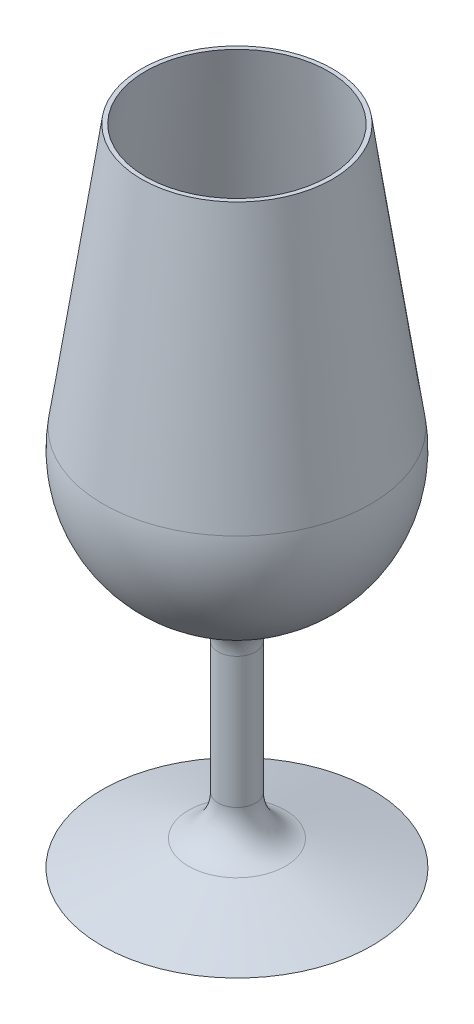
ISO-10303-21;
HEADER;
FILE_DESCRIPTION(('STEP AP214'),'2;1');
FILE_NAME('part.step','',(''),(''),'','','');
FILE_SCHEMA(('AUTOMOTIVE_DESIGN { 1 0 10303 214 1 1 1 1 }'));
ENDSEC;
DATA;
#1=APPLICATION_CONTEXT('core data for automotive mechanical design processes');
#2=APPLICATION_PROTOCOL_DEFINITION('international standard','automotive_design',2000,#1);
#3=PRODUCT_CONTEXT('',#1,'mechanical');
#4=PRODUCT('Part','Part','',(#3));
#5=PRODUCT_RELATED_PRODUCT_CATEGORY('part','',(#4));
#6=PRODUCT_DEFINITION_FORMATION('','',#4);
#7=PRODUCT_DEFINITION_CONTEXT('part definition',#1,'design');
#8=PRODUCT_DEFINITION('design','',#6,#7);
#9=PRODUCT_DEFINITION_SHAPE('','',#8);
#10=(LENGTH_UNIT() NAMED_UNIT(*) SI_UNIT(.MILLI.,.METRE.));
#11=(NAMED_UNIT(*) PLANE_ANGLE_UNIT() SI_UNIT($,.RADIAN.));
#12=(NAMED_UNIT(*) SI_UNIT($,.STERADIAN.) SOLID_ANGLE_UNIT());
#13=UNCERTAINTY_MEASURE_WITH_UNIT(LENGTH_MEASURE(1.E-05),#10,'distance_accuracy_value','');
#14=(GEOMETRIC_REPRESENTATION_CONTEXT(3) GLOBAL_UNCERTAINTY_ASSIGNED_CONTEXT((#13)) GLOBAL_UNIT_ASSIGNED_CONTEXT((#10,
#11,#12)) REPRESENTATION_CONTEXT('',''));
#15=CARTESIAN_POINT('',(0.,0.,0.));
#16=DIRECTION('',(0.,0.,1.));
#17=DIRECTION('',(1.,0.,0.));
#18=AXIS2_PLACEMENT_3D('',#15,#16,#17);
#19=CARTESIAN_POINT('',(0.,-37.0912982763871,0.));
#20=DIRECTION('',(0.,1.,0.));
#21=DIRECTION('',(0.,0.,1.));
#22=AXIS2_PLACEMENT_3D('',#19,#20,#21);
#23=PLANE('',#22);
#24=CARTESIAN_POINT('',(0.,-37.0912982763871,0.));
#25=DIRECTION('',(0.,1.,0.));
#26=DIRECTION('',(0.,0.,1.));
#27=AXIS2_PLACEMENT_3D('',#24,#25,#26);
#28=CIRCLE('',#27,32.5);
#29=CARTESIAN_POINT('',(0.,-37.0912982763871,32.5));
#30=VERTEX_POINT('',#29);
#31=EDGE_CURVE('E10',#30,#30,#28,.T.);
#32=ORIENTED_EDGE('',*,*,#31,.F.);
#33=EDGE_LOOP('',(#32));
#34=FACE_BOUND('',#33,.T.);
#35=ADVANCED_FACE('F37',(#34),#23,.F.);
#36=CARTESIAN_POINT('',(0.,-37.0912982763871,0.));
#37=DIRECTION('',(0.,-1.,0.));
#38=DIRECTION('',(0.,0.,-1.));
#39=AXIS2_PLACEMENT_3D('',#36,#37,#38);
#40=CONICAL_SURFACE('',#39,32.5,1.28350582245761);
#41=CARTESIAN_POINT('',(0.,-30.9357267356772,0.));
#42=DIRECTION('',(0.,1.,0.));
#43=DIRECTION('',(0.,0.,1.));
#44=AXIS2_PLACEMENT_3D('',#41,#42,#43);
#45=CIRCLE('',#44,11.6664517898233);
#46=CARTESIAN_POINT('',(0.,-30.9357267356772,11.6664517898233));
#47=VERTEX_POINT('',#46);
#48=EDGE_CURVE('E44',#47,#47,#45,.T.);
#49=ORIENTED_EDGE('',*,*,#48,.F.);
#50=EDGE_LOOP('',(#49));
#51=FACE_BOUND('',#50,.T.);
#52=ORIENTED_EDGE('',*,*,#31,.T.);
#53=EDGE_LOOP('',(#52));
#54=FACE_BOUND('',#53,.T.);
#55=ADVANCED_FACE('F121',(#51,#54),#40,.T.);
#56=CARTESIAN_POINT('',(0.,-21.3455753009706,0.));
#57=DIRECTION('',(0.,1.,0.));
#58=DIRECTION('',(0.,0.,1.));
#59=AXIS2_PLACEMENT_3D('',#56,#57,#58);
#60=TOROIDAL_SURFACE('',#59,14.5,10.);
#61=CARTESIAN_POINT('',(0.,-21.3455753009706,0.));
#62=DIRECTION('',(0.,1.,0.));
#63=DIRECTION('',(0.,0.,1.));
#64=AXIS2_PLACEMENT_3D('',#61,#62,#63);
#65=CIRCLE('',#64,4.50000000000001);
#66=CARTESIAN_POINT('',(0.,-21.3455753009706,4.50000000000001));
#67=VERTEX_POINT('',#66);
#68=EDGE_CURVE('E49',#67,#67,#65,.T.);
#69=ORIENTED_EDGE('',*,*,#68,.F.);
#70=EDGE_LOOP('',(#69));
#71=FACE_BOUND('',#70,.T.);
#72=ORIENTED_EDGE('',*,*,#48,.T.);
#73=EDGE_LOOP('',(#72));
#74=FACE_BOUND('',#73,.T.);
#75=ADVANCED_FACE('F116',(#71,#74),#60,.F.);
#76=CARTESIAN_POINT('',(0.,117.908701723613,0.));
#77=DIRECTION('',(0.,1.,0.));
#78=DIRECTION('',(0.,0.,1.));
#79=AXIS2_PLACEMENT_3D('',#76,#77,#78);
#80=CYLINDRICAL_SURFACE('',#79,4.50000000000001);
#81=CARTESIAN_POINT('',(0.,10.1456868915987,0.));
#82=DIRECTION('',(0.,1.,0.));
#83=DIRECTION('',(0.,0.,1.));
#84=AXIS2_PLACEMENT_3D('',#81,#82,#83);
#85=CIRCLE('',#84,4.50000000000001);
#86=CARTESIAN_POINT('',(0.,10.1456868915987,4.50000000000001));
#87=VERTEX_POINT('',#86);
#88=EDGE_CURVE('E54',#87,#87,#85,.T.);
#89=ORIENTED_EDGE('',*,*,#88,.F.);
#90=EDGE_LOOP('',(#89));
#91=FACE_BOUND('',#90,.T.);
#92=ORIENTED_EDGE('',*,*,#68,.T.);
#93=EDGE_LOOP('',(#92));
#94=FACE_BOUND('',#93,.T.);
#95=ADVANCED_FACE('F110',(#91,#94),#80,.T.);
#96=CARTESIAN_POINT('',(0.,10.1456868915987,0.));
#97=DIRECTION('',(0.,1.,0.));
#98=DIRECTION('',(0.,0.,1.));
#99=AXIS2_PLACEMENT_3D('',#96,#97,#98);
#100=TOROIDAL_SURFACE('',#99,14.5,10.);
#101=CARTESIAN_POINT('',(0.,19.545679529452,0.));
#102=DIRECTION('',(0.,1.,0.));
#103=DIRECTION('',(0.,0.,1.));
#104=AXIS2_PLACEMENT_3D('',#101,#102,#103);
#105=CIRCLE('',#104,11.0882352941177);
#106=CARTESIAN_POINT('',(11.0882352941176,19.545679529452,0.));
#107=VERTEX_POINT('',#106);
#108=EDGE_CURVE('E60',#107,#107,#105,.T.);
#109=ORIENTED_EDGE('',*,*,#108,.F.);
#110=EDGE_LOOP('',(#109));
#111=FACE_BOUND('',#110,.T.);
#112=ORIENTED_EDGE('',*,*,#88,.T.);
#113=EDGE_LOOP('',(#112));
#114=FACE_BOUND('',#113,.T.);
#115=ADVANCED_FACE('F104',(#111,#114),#100,.F.);
#116=CARTESIAN_POINT('',(0.,50.095655602475,0.));
#117=DIRECTION('',(0.,1.,0.));
#118=DIRECTION('',(1.,0.,0.));
#119=AXIS2_PLACEMENT_3D('',#116,#117,#118);
#120=SPHERICAL_SURFACE('',#119,32.5);
#121=CARTESIAN_POINT('',(0.,54.7628687751407,0.));
#122=DIRECTION('',(0.,1.,0.));
#123=DIRECTION('',(0.,0.,1.));
#124=AXIS2_PLACEMENT_3D('',#121,#122,#123);
#125=CIRCLE('',#124,32.1631329506455);
#126=CARTESIAN_POINT('',(32.1631329506455,54.7628687751407,0.));
#127=VERTEX_POINT('',#126);
#128=EDGE_CURVE('E64',#127,#127,#125,.T.);
#129=CARTESIAN_POINT('',(32.1631329506455,54.7628687751407,0.));
#130=CARTESIAN_POINT('',(32.2295855764521,54.3049693005461,0.));
#131=CARTESIAN_POINT('',(32.2862470117428,53.8456495036334,0.));
#132=CARTESIAN_POINT('',(32.3799124329892,52.9250098961236,0.));
#133=CARTESIAN_POINT('',(32.4169164189449,52.4636900855266,0.));
#134=CARTESIAN_POINT('',(32.4711918732182,51.5398910816006,0.));
#135=CARTESIAN_POINT('',(32.4884633415358,51.0774118882715,0.));
#136=CARTESIAN_POINT('',(32.5032442892444,50.1521378418659,0.));
#137=CARTESIAN_POINT('',(32.5007537686355,49.6893429887892,0.));
#138=CARTESIAN_POINT('',(32.4760147369736,48.7642816597027,0.));
#139=CARTESIAN_POINT('',(32.4537662259206,48.3020151836928,0.));
#140=CARTESIAN_POINT('',(32.3895519382196,47.3788537520232,0.));
#141=CARTESIAN_POINT('',(32.3475861615715,46.9179587963634,0.));
#142=CARTESIAN_POINT('',(32.2440138450611,45.9983810283555,0.));
#143=CARTESIAN_POINT('',(32.1824073051988,45.5396982160074,0.));
#144=CARTESIAN_POINT('',(32.0396658369768,44.6253813278921,0.));
#145=CARTESIAN_POINT('',(31.958530908617,44.1697472521247,0.));
#146=CARTESIAN_POINT('',(31.7768806427019,43.2623588684949,0.));
#147=CARTESIAN_POINT('',(31.6763653051466,42.8106045606323,0.));
#148=CARTESIAN_POINT('',(31.4561375516523,41.911799668184,0.));
#149=CARTESIAN_POINT('',(31.3364251357134,41.4647490835983,0.));
#150=CARTESIAN_POINT('',(31.0780215688887,40.5761670138512,0.));
#151=CARTESIAN_POINT('',(30.9393304180028,40.1346355286898,0.));
#152=CARTESIAN_POINT('',(30.6432223403166,39.2578969676724,0.));
#153=CARTESIAN_POINT('',(30.4858054135161,38.8226898918162,0.));
#154=CARTESIAN_POINT('',(30.1525328969328,37.9593939241843,0.));
#155=CARTESIAN_POINT('',(29.9766773071498,37.5313050324084,0.));
#156=CARTESIAN_POINT('',(29.6068482078542,36.6830262248483,0.));
#157=CARTESIAN_POINT('',(29.4128746983416,36.262836309064,0.));
#158=CARTESIAN_POINT('',(29.007163548133,35.4311218384449,0.));
#159=CARTESIAN_POINT('',(28.795425907437,35.0195972836101,0.));
#160=CARTESIAN_POINT('',(28.3545726834323,34.2059641150841,0.));
#161=CARTESIAN_POINT('',(28.1254571001236,33.8038555013929,0.));
#162=CARTESIAN_POINT('',(27.6502658751168,33.0097876216009,0.));
#163=CARTESIAN_POINT('',(27.4041902334187,32.6178283554999,0.));
#164=CARTESIAN_POINT('',(26.8955277093303,31.8447740659258,0.));
#165=CARTESIAN_POINT('',(26.63294082694,31.4636790424526,0.));
#166=CARTESIAN_POINT('',(26.0917347540382,30.7130483178649,0.));
#167=CARTESIAN_POINT('',(25.8131155635267,30.3435126167504,0.));
#168=CARTESIAN_POINT('',(25.240353048303,29.6166745335462,0.));
#169=CARTESIAN_POINT('',(24.9462097235907,29.2593721514565,0.));
#170=CARTESIAN_POINT('',(24.3429354283731,28.5576523906052,0.));
#171=CARTESIAN_POINT('',(24.0338044578678,28.2132350118436,0.));
#172=CARTESIAN_POINT('',(23.4011186954665,27.53791344096,0.));
#173=CARTESIAN_POINT('',(23.0775639035706,27.2070092488379,0.));
#174=CARTESIAN_POINT('',(22.4166206303916,26.5593175878886,0.));
#175=CARTESIAN_POINT('',(22.0792321491085,26.2425301190614,0.));
#176=CARTESIAN_POINT('',(21.3912368605415,25.6236496936094,0.));
#177=CARTESIAN_POINT('',(21.0406300532576,25.3215567369845,0.));
#178=CARTESIAN_POINT('',(20.3268375846329,24.732616324389,0.));
#179=CARTESIAN_POINT('',(19.9636519232922,24.4457688684184,0.));
#180=CARTESIAN_POINT('',(19.2253641624486,23.88784263599,0.));
#181=CARTESIAN_POINT('',(18.8502620629457,23.6167638595322,0.));
#182=CARTESIAN_POINT('',(18.0888255709987,23.0908694168034,0.));
#183=CARTESIAN_POINT('',(17.7024911785546,22.8360537505323,0.));
#184=CARTESIAN_POINT('',(16.9192947515051,22.3431502505202,0.));
#185=CARTESIAN_POINT('',(16.5224327168998,22.105062416779,0.));
#186=CARTESIAN_POINT('',(15.7189047869106,21.6460489660108,0.));
#187=CARTESIAN_POINT('',(15.3122388915267,21.4251233489837,0.));
#188=CARTESIAN_POINT('',(14.4898451667864,21.0008367726289,0.));
#189=CARTESIAN_POINT('',(14.07411733743,20.797475813301,0.));
#190=CARTESIAN_POINT('',(13.2343572138089,20.4086913494046,0.));
#191=CARTESIAN_POINT('',(12.8103249195442,20.2232678448361,0.));
#192=CARTESIAN_POINT('',(11.9547321608093,19.8706894432665,0.));
#193=CARTESIAN_POINT('',(11.5231716963392,19.7035345462654,0.));
#194=CARTESIAN_POINT('',(11.0882352941176,19.545679529452,0.));
#195=B_SPLINE_CURVE_WITH_KNOTS('',3,(#129,#130,#131,#132,#133,#134,#135,#136,#137,#138,#139,
#140,#141,#142,#143,#144,#145,#146,#147,#148,#149,#150,#151,#152,#153,#154,#155,#156,#157,#158,
#159,#160,#161,#162,#163,#164,#165,#166,#167,#168,#169,#170,#171,#172,#173,#174,#175,#176,#177,
#178,#179,#180,#181,#182,#183,#184,#185,#186,#187,#188,#189,#190,#191,#192,#193,#194),
.UNSPECIFIED.,.F.,.F.,(4,2,2,2,2,2,2,2,2,2,2,2,2,2,2,2,2,2,2,2,2,2,2,2,2,2,2,2,2,2,2,2,4),(0.,
1.3879826400544,2.77596528010881,4.16394792016321,5.55193056021761,6.93991320027201,
8.32789584032642,9.71587848038082,11.1038611204352,12.4918437604896,13.879826400544,
15.2678090405984,16.6557916806528,18.0437743207072,19.4317569607616,20.819739600816,
22.2077222408705,23.5957048809248,24.9836875209792,26.3716701610337,27.7596528010881,
29.1476354411425,30.5356180811969,31.9236007212513,33.3115833613057,34.6995660013601,
36.0875486414145,37.4755312814689,38.8635139215233,40.2514965615777,41.6394792016321,
43.0274618416865,44.4154444817409),.UNSPECIFIED.);
#196=EDGE_CURVE('BSEAM98',#127,#107,#195,.T.);
#197=ORIENTED_EDGE('',*,*,#128,.F.);
#198=ORIENTED_EDGE('',*,*,#108,.T.);
#199=ORIENTED_EDGE('',*,*,#196,.T.);
#200=ORIENTED_EDGE('',*,*,#196,.F.);
#201=EDGE_LOOP('',(#197,#199,#198,#200));
#202=FACE_BOUND('',#201,.T.);
#203=ADVANCED_FACE('F98',(#202),#120,.T.);
#204=CARTESIAN_POINT('',(0.,54.7628687751407,0.));
#205=DIRECTION('',(0.,-1.,0.));
#206=DIRECTION('',(0.,0.,-1.));
#207=AXIS2_PLACEMENT_3D('',#204,#205,#206);
#208=CONICAL_SURFACE('',#207,32.1631329506455,0.144104792839711);
#209=CARTESIAN_POINT('',(0.,117.908701723613,0.));
#210=DIRECTION('',(0.,1.,0.));
#211=DIRECTION('',(0.,0.,1.));
#212=AXIS2_PLACEMENT_3D('',#209,#210,#211);
#213=CIRCLE('',#212,23.);
#214=CARTESIAN_POINT('',(0.,117.908701723613,23.));
#215=VERTEX_POINT('',#214);
#216=EDGE_CURVE('E68',#215,#215,#213,.T.);
#217=ORIENTED_EDGE('',*,*,#216,.F.);
#218=EDGE_LOOP('',(#217));
#219=FACE_BOUND('',#218,.T.);
#220=ORIENTED_EDGE('',*,*,#128,.T.);
#221=EDGE_LOOP('',(#220));
#222=FACE_BOUND('',#221,.T.);
#223=ADVANCED_FACE('F92',(#219,#222),#208,.T.);
#224=CARTESIAN_POINT('',(21.9895262986391,117.908701723613,0.));
#225=DIRECTION('',(0.,-1.,0.));
#226=DIRECTION('',(0.,0.,-1.));
#227=AXIS2_PLACEMENT_3D('',#224,#225,#226);
#228=PLANE('',#227);
#229=CARTESIAN_POINT('',(0.,117.908701723613,0.));
#230=DIRECTION('',(0.,1.,0.));
#231=DIRECTION('',(0.,0.,1.));
#232=AXIS2_PLACEMENT_3D('',#229,#230,#231);
#233=CIRCLE('',#232,21.9895262986391);
#234=CARTESIAN_POINT('',(0.,117.908701723613,21.9895262986391));
#235=VERTEX_POINT('',#234);
#236=EDGE_CURVE('E72',#235,#235,#233,.T.);
#237=ORIENTED_EDGE('',*,*,#236,.F.);
#238=EDGE_LOOP('',(#237));
#239=FACE_BOUND('',#238,.T.);
#240=ORIENTED_EDGE('',*,*,#216,.T.);
#241=EDGE_LOOP('',(#240));
#242=FACE_BOUND('',#241,.T.);
#243=ADVANCED_FACE('F86',(#239,#242),#228,.F.);
#244=CARTESIAN_POINT('',(0.,117.908701723613,0.));
#245=DIRECTION('',(0.,-1.,0.));
#246=DIRECTION('',(0.,0.,-1.));
#247=AXIS2_PLACEMENT_3D('',#244,#245,#246);
#248=CONICAL_SURFACE('',#247,21.9895262986391,0.144104792839711);
#249=CARTESIAN_POINT('',(0.,54.6192622159817,0.));
#250=DIRECTION('',(0.,1.,0.));
#251=DIRECTION('',(0.,0.,1.));
#252=AXIS2_PLACEMENT_3D('',#249,#250,#251);
#253=CIRCLE('',#252,31.1734980906256);
#254=CARTESIAN_POINT('',(0.,54.6192622159817,31.1734980906256));
#255=VERTEX_POINT('',#254);
#256=EDGE_CURVE('E76',#255,#255,#253,.T.);
#257=ORIENTED_EDGE('',*,*,#256,.F.);
#258=EDGE_LOOP('',(#257));
#259=FACE_BOUND('',#258,.T.);
#260=ORIENTED_EDGE('',*,*,#236,.T.);
#261=EDGE_LOOP('',(#260));
#262=FACE_BOUND('',#261,.T.);
#263=ADVANCED_FACE('F83',(#259,#262),#248,.F.);
#264=CARTESIAN_POINT('',(0.,50.095655602475,0.));
#265=DIRECTION('',(0.,1.,0.));
#266=DIRECTION('',(1.,0.,0.));
#267=AXIS2_PLACEMENT_3D('',#264,#265,#266);
#268=SPHERICAL_SURFACE('',#267,31.5);
#269=ORIENTED_EDGE('',*,*,#256,.T.);
#270=EDGE_LOOP('',(#269));
#271=FACE_BOUND('',#270,.T.);
#272=ADVANCED_FACE('F81',(#271),#268,.F.);
#273=CLOSED_SHELL('',(#35,#55,#75,#95,#115,#203,#223,#243,#263,#272));
#274=MANIFOLD_SOLID_BREP('B2',#273);
#275=ADVANCED_BREP_SHAPE_REPRESENTATION('',(#18,#274),#14);
#276=SHAPE_DEFINITION_REPRESENTATION(#9,#275);
ENDSEC;
END-ISO-10303-21;
